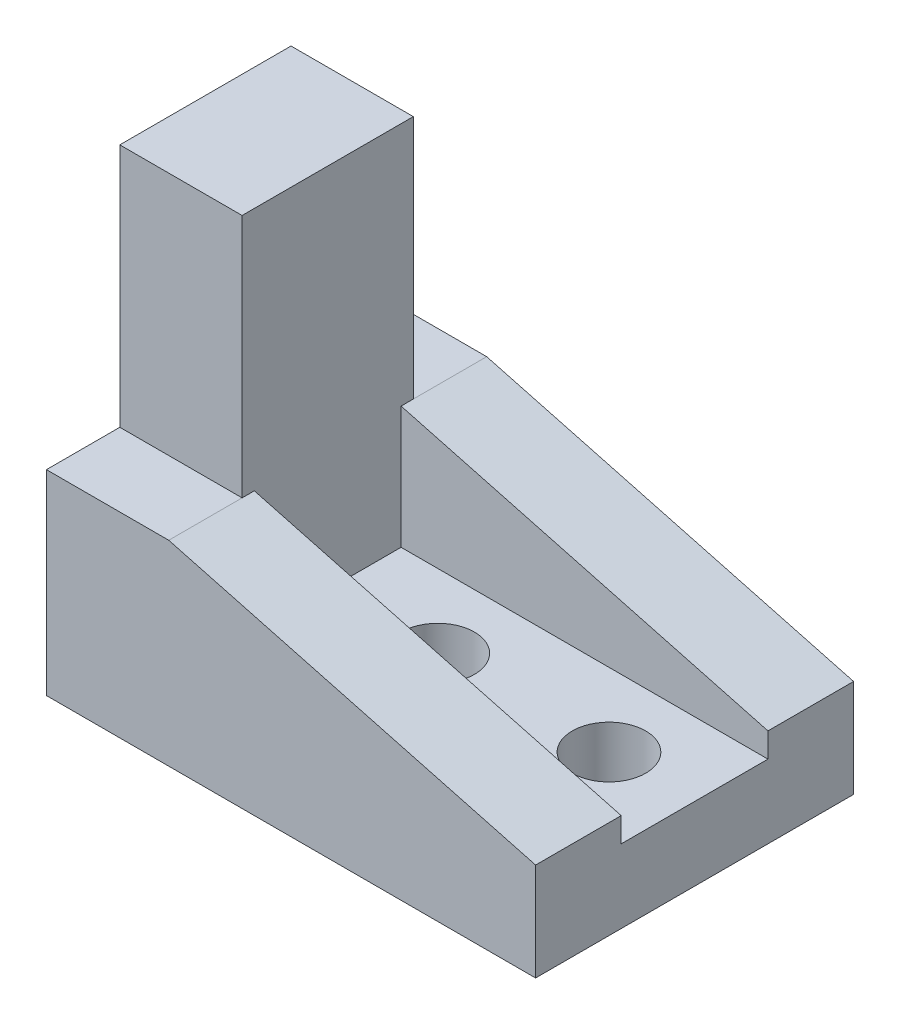
ISO-10303-21;
HEADER;
FILE_DESCRIPTION(('STEP AP214'),'2;1');
FILE_NAME('part.step','',(''),(''),'','','');
FILE_SCHEMA(('AUTOMOTIVE_DESIGN { 1 0 10303 214 1 1 1 1 }'));
ENDSEC;
DATA;
#1=APPLICATION_CONTEXT('core data for automotive mechanical design processes');
#2=APPLICATION_PROTOCOL_DEFINITION('international standard','automotive_design',2000,#1);
#3=PRODUCT_CONTEXT('',#1,'mechanical');
#4=PRODUCT('Part','Part','',(#3));
#5=PRODUCT_RELATED_PRODUCT_CATEGORY('part','',(#4));
#6=PRODUCT_DEFINITION_FORMATION('','',#4);
#7=PRODUCT_DEFINITION_CONTEXT('part definition',#1,'design');
#8=PRODUCT_DEFINITION('design','',#6,#7);
#9=PRODUCT_DEFINITION_SHAPE('','',#8);
#10=(LENGTH_UNIT() NAMED_UNIT(*) SI_UNIT(.MILLI.,.METRE.));
#11=(NAMED_UNIT(*) PLANE_ANGLE_UNIT() SI_UNIT($,.RADIAN.));
#12=(NAMED_UNIT(*) SI_UNIT($,.STERADIAN.) SOLID_ANGLE_UNIT());
#13=UNCERTAINTY_MEASURE_WITH_UNIT(LENGTH_MEASURE(1.E-05),#10,'distance_accuracy_value','');
#14=(GEOMETRIC_REPRESENTATION_CONTEXT(3) GLOBAL_UNCERTAINTY_ASSIGNED_CONTEXT((#13)) GLOBAL_UNIT_ASSIGNED_CONTEXT((#10,
#11,#12)) REPRESENTATION_CONTEXT('',''));
#15=CARTESIAN_POINT('',(0.,0.,0.));
#16=DIRECTION('',(0.,0.,1.));
#17=DIRECTION('',(1.,0.,0.));
#18=AXIS2_PLACEMENT_3D('',#15,#16,#17);
#19=CARTESIAN_POINT('',(20.,0.,13.));
#20=DIRECTION('',(-1.,0.,0.));
#21=DIRECTION('',(0.,0.,1.));
#22=AXIS2_PLACEMENT_3D('',#19,#20,#21);
#23=PLANE('',#22);
#24=DIRECTION('',(0.,1.,0.));
#25=VECTOR('',#24,1.);
#26=CARTESIAN_POINT('',(20.,3.,3.5));
#27=LINE('',#26,#25);
#28=CARTESIAN_POINT('',(20.,3.,3.5));
#29=VERTEX_POINT('',#28);
#30=CARTESIAN_POINT('',(20.,4.,3.5));
#31=VERTEX_POINT('',#30);
#32=EDGE_CURVE('E150',#29,#31,#27,.T.);
#33=ORIENTED_EDGE('',*,*,#32,.F.);
#34=DIRECTION('',(0.,0.,1.));
#35=VECTOR('',#34,1.);
#36=CARTESIAN_POINT('',(20.,3.,9.5));
#37=LINE('',#36,#35);
#38=CARTESIAN_POINT('',(20.,3.,9.5));
#39=VERTEX_POINT('',#38);
#40=EDGE_CURVE('E136',#29,#39,#37,.T.);
#41=ORIENTED_EDGE('',*,*,#40,.T.);
#42=DIRECTION('',(0.,1.,0.));
#43=VECTOR('',#42,1.);
#44=CARTESIAN_POINT('',(20.,3.,9.5));
#45=LINE('',#44,#43);
#46=CARTESIAN_POINT('',(20.,4.,9.5));
#47=VERTEX_POINT('',#46);
#48=EDGE_CURVE('E154',#39,#47,#45,.T.);
#49=ORIENTED_EDGE('',*,*,#48,.T.);
#50=DIRECTION('',(0.,0.,-1.));
#51=VECTOR('',#50,1.);
#52=CARTESIAN_POINT('',(20.,4.,13.));
#53=LINE('',#52,#51);
#54=CARTESIAN_POINT('',(20.,4.,13.));
#55=VERTEX_POINT('',#54);
#56=EDGE_CURVE('E212',#55,#47,#53,.T.);
#57=ORIENTED_EDGE('',*,*,#56,.F.);
#58=DIRECTION('',(0.,1.,0.));
#59=VECTOR('',#58,1.);
#60=CARTESIAN_POINT('',(20.,0.,13.));
#61=LINE('',#60,#59);
#62=CARTESIAN_POINT('',(20.,0.,13.));
#63=VERTEX_POINT('',#62);
#64=EDGE_CURVE('E188',#63,#55,#61,.T.);
#65=ORIENTED_EDGE('',*,*,#64,.F.);
#66=DIRECTION('',(0.,0.,-1.));
#67=VECTOR('',#66,1.);
#68=CARTESIAN_POINT('',(20.,0.,13.));
#69=LINE('',#68,#67);
#70=CARTESIAN_POINT('',(20.,0.,0.));
#71=VERTEX_POINT('',#70);
#72=EDGE_CURVE('E215',#63,#71,#69,.T.);
#73=ORIENTED_EDGE('',*,*,#72,.T.);
#74=DIRECTION('',(0.,1.,0.));
#75=VECTOR('',#74,1.);
#76=CARTESIAN_POINT('',(20.,0.,0.));
#77=LINE('',#76,#75);
#78=CARTESIAN_POINT('',(20.,4.,0.));
#79=VERTEX_POINT('',#78);
#80=EDGE_CURVE('E197',#71,#79,#77,.T.);
#81=ORIENTED_EDGE('',*,*,#80,.T.);
#82=EDGE_CURVE('E210',#31,#79,#53,.T.);
#83=ORIENTED_EDGE('',*,*,#82,.F.);
#84=EDGE_LOOP('',(#33,#41,#49,#57,#65,#73,#81,#83));
#85=FACE_BOUND('',#84,.T.);
#86=ADVANCED_FACE('F36',(#85),#23,.F.);
#87=CARTESIAN_POINT('',(5.,8.,13.));
#88=DIRECTION('',(-0.257662650560332,-0.966234939601246,0.));
#89=DIRECTION('',(0.966234939601246,-0.257662650560332,0.));
#90=AXIS2_PLACEMENT_3D('',#87,#88,#89);
#91=PLANE('',#90);
#92=DIRECTION('',(-0.966234939601246,0.257662650560332,0.));
#93=VECTOR('',#92,1.);
#94=CARTESIAN_POINT('',(5.,8.,3.5));
#95=LINE('',#94,#93);
#96=CARTESIAN_POINT('',(5.,8.,3.50000000000001));
#97=VERTEX_POINT('',#96);
#98=EDGE_CURVE('E11',#31,#97,#95,.T.);
#99=ORIENTED_EDGE('',*,*,#98,.F.);
#100=ORIENTED_EDGE('',*,*,#82,.T.);
#101=DIRECTION('',(-0.966234939601246,0.257662650560332,0.));
#102=VECTOR('',#101,1.);
#103=CARTESIAN_POINT('',(5.,8.,0.));
#104=LINE('',#103,#102);
#105=CARTESIAN_POINT('',(5.,8.,0.));
#106=VERTEX_POINT('',#105);
#107=EDGE_CURVE('E186',#79,#106,#104,.T.);
#108=ORIENTED_EDGE('',*,*,#107,.T.);
#109=DIRECTION('',(0.,0.,1.));
#110=VECTOR('',#109,1.);
#111=CARTESIAN_POINT('',(5.,8.,13.));
#112=LINE('',#111,#110);
#113=CARTESIAN_POINT('',(5.,8.,3.));
#114=VERTEX_POINT('',#113);
#115=EDGE_CURVE('E168',#106,#114,#112,.T.);
#116=ORIENTED_EDGE('',*,*,#115,.T.);
#117=DIRECTION('',(0.,0.,-1.));
#118=VECTOR('',#117,1.);
#119=CARTESIAN_POINT('',(5.,8.,13.));
#120=LINE('',#119,#118);
#121=EDGE_CURVE('E207',#97,#114,#120,.T.);
#122=ORIENTED_EDGE('',*,*,#121,.F.);
#123=EDGE_LOOP('',(#99,#100,#108,#116,#122));
#124=FACE_BOUND('',#123,.T.);
#125=ADVANCED_FACE('F251',(#124),#91,.F.);
#126=DIRECTION('',(0.966234939601246,-0.257662650560332,0.));
#127=VECTOR('',#126,1.);
#128=CARTESIAN_POINT('',(5.,8.,9.5));
#129=LINE('',#128,#127);
#130=CARTESIAN_POINT('',(5.,8.,9.5));
#131=VERTEX_POINT('',#130);
#132=EDGE_CURVE('E44',#131,#47,#129,.T.);
#133=ORIENTED_EDGE('',*,*,#132,.F.);
#134=CARTESIAN_POINT('',(5.,8.,10.));
#135=VERTEX_POINT('',#134);
#136=EDGE_CURVE('E211',#135,#131,#120,.T.);
#137=ORIENTED_EDGE('',*,*,#136,.F.);
#138=CARTESIAN_POINT('',(5.,8.,13.));
#139=VERTEX_POINT('',#138);
#140=EDGE_CURVE('E208',#139,#135,#120,.T.);
#141=ORIENTED_EDGE('',*,*,#140,.F.);
#142=DIRECTION('',(-0.966234939601246,0.257662650560332,0.));
#143=VECTOR('',#142,1.);
#144=CARTESIAN_POINT('',(5.,8.,13.));
#145=LINE('',#144,#143);
#146=EDGE_CURVE('E190',#55,#139,#145,.T.);
#147=ORIENTED_EDGE('',*,*,#146,.F.);
#148=ORIENTED_EDGE('',*,*,#56,.T.);
#149=EDGE_LOOP('',(#133,#137,#141,#147,#148));
#150=FACE_BOUND('',#149,.T.);
#151=ADVANCED_FACE('F234',(#150),#91,.F.);
#152=CARTESIAN_POINT('',(0.,0.,13.));
#153=DIRECTION('',(1.,0.,0.));
#154=DIRECTION('',(0.,0.,-1.));
#155=AXIS2_PLACEMENT_3D('',#152,#153,#154);
#156=PLANE('',#155);
#157=DIRECTION('',(0.,0.,-1.));
#158=VECTOR('',#157,1.);
#159=CARTESIAN_POINT('',(0.,18.,13.));
#160=LINE('',#159,#158);
#161=CARTESIAN_POINT('',(0.,18.,10.));
#162=VERTEX_POINT('',#161);
#163=CARTESIAN_POINT('',(0.,18.,3.));
#164=VERTEX_POINT('',#163);
#165=EDGE_CURVE('E193',#162,#164,#160,.T.);
#166=ORIENTED_EDGE('',*,*,#165,.T.);
#167=DIRECTION('',(0.,1.,0.));
#168=VECTOR('',#167,1.);
#169=CARTESIAN_POINT('',(0.,8.,3.));
#170=LINE('',#169,#168);
#171=CARTESIAN_POINT('',(0.,8.,3.));
#172=VERTEX_POINT('',#171);
#173=EDGE_CURVE('E161',#172,#164,#170,.T.);
#174=ORIENTED_EDGE('',*,*,#173,.F.);
#175=DIRECTION('',(0.,0.,1.));
#176=VECTOR('',#175,1.);
#177=CARTESIAN_POINT('',(0.,8.,0.));
#178=LINE('',#177,#176);
#179=CARTESIAN_POINT('',(0.,8.,0.));
#180=VERTEX_POINT('',#179);
#181=EDGE_CURVE('E158',#180,#172,#178,.T.);
#182=ORIENTED_EDGE('',*,*,#181,.F.);
#183=DIRECTION('',(0.,-1.,0.));
#184=VECTOR('',#183,1.);
#185=CARTESIAN_POINT('',(0.,0.,0.));
#186=LINE('',#185,#184);
#187=CARTESIAN_POINT('',(0.,0.,0.));
#188=VERTEX_POINT('',#187);
#189=EDGE_CURVE('E182',#180,#188,#186,.T.);
#190=ORIENTED_EDGE('',*,*,#189,.T.);
#191=DIRECTION('',(0.,0.,-1.));
#192=VECTOR('',#191,1.);
#193=CARTESIAN_POINT('',(0.,0.,13.));
#194=LINE('',#193,#192);
#195=CARTESIAN_POINT('',(0.,0.,13.));
#196=VERTEX_POINT('',#195);
#197=EDGE_CURVE('E218',#196,#188,#194,.T.);
#198=ORIENTED_EDGE('',*,*,#197,.F.);
#199=DIRECTION('',(0.,-1.,0.));
#200=VECTOR('',#199,1.);
#201=CARTESIAN_POINT('',(0.,0.,13.));
#202=LINE('',#201,#200);
#203=CARTESIAN_POINT('',(0.,8.,13.));
#204=VERTEX_POINT('',#203);
#205=EDGE_CURVE('E183',#204,#196,#202,.T.);
#206=ORIENTED_EDGE('',*,*,#205,.F.);
#207=DIRECTION('',(0.,0.,1.));
#208=VECTOR('',#207,1.);
#209=CARTESIAN_POINT('',(0.,8.,13.));
#210=LINE('',#209,#208);
#211=CARTESIAN_POINT('',(0.,8.,10.));
#212=VERTEX_POINT('',#211);
#213=EDGE_CURVE('E58',#212,#204,#210,.T.);
#214=ORIENTED_EDGE('',*,*,#213,.F.);
#215=DIRECTION('',(0.,-1.,0.));
#216=VECTOR('',#215,1.);
#217=CARTESIAN_POINT('',(0.,8.,10.));
#218=LINE('',#217,#216);
#219=EDGE_CURVE('E149',#162,#212,#218,.T.);
#220=ORIENTED_EDGE('',*,*,#219,.F.);
#221=EDGE_LOOP('',(#166,#174,#182,#190,#198,#206,#214,#220));
#222=FACE_BOUND('',#221,.T.);
#223=ADVANCED_FACE('F38',(#222),#156,.F.);
#224=CARTESIAN_POINT('',(0.,0.,13.));
#225=DIRECTION('',(0.,1.,0.));
#226=DIRECTION('',(0.,0.,1.));
#227=AXIS2_PLACEMENT_3D('',#224,#225,#226);
#228=PLANE('',#227);
#229=CARTESIAN_POINT('',(16.5,0.,6.5));
#230=DIRECTION('',(0.,1.,0.));
#231=DIRECTION('',(0.,0.,1.));
#232=AXIS2_PLACEMENT_3D('',#229,#230,#231);
#233=CIRCLE('',#232,1.5);
#234=CARTESIAN_POINT('',(16.5,0.,8.));
#235=VERTEX_POINT('',#234);
#236=EDGE_CURVE('E144',#235,#235,#233,.T.);
#237=ORIENTED_EDGE('',*,*,#236,.T.);
#238=EDGE_LOOP('',(#237));
#239=FACE_BOUND('',#238,.T.);
#240=CARTESIAN_POINT('',(9.5,0.,6.5));
#241=DIRECTION('',(0.,1.,0.));
#242=DIRECTION('',(0.,0.,1.));
#243=AXIS2_PLACEMENT_3D('',#240,#241,#242);
#244=CIRCLE('',#243,1.5);
#245=CARTESIAN_POINT('',(9.5,0.,8.));
#246=VERTEX_POINT('',#245);
#247=EDGE_CURVE('E323',#246,#246,#244,.T.);
#248=ORIENTED_EDGE('',*,*,#247,.T.);
#249=EDGE_LOOP('',(#248));
#250=FACE_BOUND('',#249,.T.);
#251=DIRECTION('',(1.,0.,0.));
#252=VECTOR('',#251,1.);
#253=CARTESIAN_POINT('',(0.,0.,0.));
#254=LINE('',#253,#252);
#255=EDGE_CURVE('E195',#188,#71,#254,.T.);
#256=ORIENTED_EDGE('',*,*,#255,.T.);
#257=ORIENTED_EDGE('',*,*,#72,.F.);
#258=DIRECTION('',(1.,0.,0.));
#259=VECTOR('',#258,1.);
#260=CARTESIAN_POINT('',(0.,0.,13.));
#261=LINE('',#260,#259);
#262=EDGE_CURVE('E185',#196,#63,#261,.T.);
#263=ORIENTED_EDGE('',*,*,#262,.F.);
#264=ORIENTED_EDGE('',*,*,#197,.T.);
#265=EDGE_LOOP('',(#256,#257,#263,#264));
#266=FACE_BOUND('',#265,.T.);
#267=ADVANCED_FACE('F266',(#239,#250,#266),#228,.F.);
#268=CARTESIAN_POINT('',(5.,18.,13.));
#269=DIRECTION('',(-1.,0.,0.));
#270=DIRECTION('',(0.,-1.,0.));
#271=AXIS2_PLACEMENT_3D('',#268,#269,#270);
#272=PLANE('',#271);
#273=ORIENTED_EDGE('',*,*,#136,.T.);
#274=DIRECTION('',(0.,1.,0.));
#275=VECTOR('',#274,1.);
#276=CARTESIAN_POINT('',(5.,3.,9.5));
#277=LINE('',#276,#275);
#278=CARTESIAN_POINT('',(5.,3.,9.5));
#279=VERTEX_POINT('',#278);
#280=EDGE_CURVE('E143',#279,#131,#277,.T.);
#281=ORIENTED_EDGE('',*,*,#280,.F.);
#282=DIRECTION('',(0.,0.,-1.));
#283=VECTOR('',#282,1.);
#284=CARTESIAN_POINT('',(5.,3.,3.5));
#285=LINE('',#284,#283);
#286=CARTESIAN_POINT('',(5.,3.,3.5));
#287=VERTEX_POINT('',#286);
#288=EDGE_CURVE('E133',#279,#287,#285,.T.);
#289=ORIENTED_EDGE('',*,*,#288,.T.);
#290=DIRECTION('',(0.,1.,0.));
#291=VECTOR('',#290,1.);
#292=CARTESIAN_POINT('',(5.,3.,3.5));
#293=LINE('',#292,#291);
#294=EDGE_CURVE('E51',#287,#97,#293,.T.);
#295=ORIENTED_EDGE('',*,*,#294,.T.);
#296=ORIENTED_EDGE('',*,*,#121,.T.);
#297=DIRECTION('',(0.,1.,0.));
#298=VECTOR('',#297,1.);
#299=CARTESIAN_POINT('',(5.,18.,3.));
#300=LINE('',#299,#298);
#301=CARTESIAN_POINT('',(5.,18.,3.));
#302=VERTEX_POINT('',#301);
#303=EDGE_CURVE('E179',#114,#302,#300,.T.);
#304=ORIENTED_EDGE('',*,*,#303,.T.);
#305=DIRECTION('',(0.,0.,-1.));
#306=VECTOR('',#305,1.);
#307=CARTESIAN_POINT('',(5.,18.,13.));
#308=LINE('',#307,#306);
#309=CARTESIAN_POINT('',(5.,18.,10.));
#310=VERTEX_POINT('',#309);
#311=EDGE_CURVE('E204',#310,#302,#308,.T.);
#312=ORIENTED_EDGE('',*,*,#311,.F.);
#313=DIRECTION('',(0.,-1.,0.));
#314=VECTOR('',#313,1.);
#315=CARTESIAN_POINT('',(5.,18.,10.));
#316=LINE('',#315,#314);
#317=EDGE_CURVE('E176',#310,#135,#316,.T.);
#318=ORIENTED_EDGE('',*,*,#317,.T.);
#319=EDGE_LOOP('',(#273,#281,#289,#295,#296,#304,#312,#318));
#320=FACE_BOUND('',#319,.T.);
#321=ADVANCED_FACE('F142',(#320),#272,.F.);
#322=CARTESIAN_POINT('',(0.,18.,13.));
#323=DIRECTION('',(0.,-1.,0.));
#324=DIRECTION('',(0.,0.,-1.));
#325=AXIS2_PLACEMENT_3D('',#322,#323,#324);
#326=PLANE('',#325);
#327=ORIENTED_EDGE('',*,*,#311,.T.);
#328=DIRECTION('',(-1.,0.,0.));
#329=VECTOR('',#328,1.);
#330=CARTESIAN_POINT('',(20.,18.,3.));
#331=LINE('',#330,#329);
#332=EDGE_CURVE('E165',#302,#164,#331,.T.);
#333=ORIENTED_EDGE('',*,*,#332,.T.);
#334=ORIENTED_EDGE('',*,*,#165,.F.);
#335=DIRECTION('',(-1.,0.,0.));
#336=VECTOR('',#335,1.);
#337=CARTESIAN_POINT('',(20.,18.,10.));
#338=LINE('',#337,#336);
#339=EDGE_CURVE('E171',#310,#162,#338,.T.);
#340=ORIENTED_EDGE('',*,*,#339,.F.);
#341=EDGE_LOOP('',(#327,#333,#334,#340));
#342=FACE_BOUND('',#341,.T.);
#343=ADVANCED_FACE('F261',(#342),#326,.F.);
#344=CARTESIAN_POINT('',(0.,0.,13.));
#345=DIRECTION('',(0.,0.,-1.));
#346=DIRECTION('',(-1.,0.,0.));
#347=AXIS2_PLACEMENT_3D('',#344,#345,#346);
#348=PLANE('',#347);
#349=ORIENTED_EDGE('',*,*,#146,.T.);
#350=DIRECTION('',(-1.,0.,0.));
#351=VECTOR('',#350,1.);
#352=CARTESIAN_POINT('',(0.,8.,13.));
#353=LINE('',#352,#351);
#354=EDGE_CURVE('E223',#139,#204,#353,.T.);
#355=ORIENTED_EDGE('',*,*,#354,.T.);
#356=ORIENTED_EDGE('',*,*,#205,.T.);
#357=ORIENTED_EDGE('',*,*,#262,.T.);
#358=ORIENTED_EDGE('',*,*,#64,.T.);
#359=EDGE_LOOP('',(#349,#355,#356,#357,#358));
#360=FACE_BOUND('',#359,.T.);
#361=ADVANCED_FACE('F237',(#360),#348,.F.);
#362=CARTESIAN_POINT('',(0.,0.,0.));
#363=DIRECTION('',(0.,0.,-1.));
#364=DIRECTION('',(-1.,0.,0.));
#365=AXIS2_PLACEMENT_3D('',#362,#363,#364);
#366=PLANE('',#365);
#367=DIRECTION('',(-1.,0.,0.));
#368=VECTOR('',#367,1.);
#369=CARTESIAN_POINT('',(0.,8.,0.));
#370=LINE('',#369,#368);
#371=EDGE_CURVE('E221',#106,#180,#370,.T.);
#372=ORIENTED_EDGE('',*,*,#371,.F.);
#373=ORIENTED_EDGE('',*,*,#107,.F.);
#374=ORIENTED_EDGE('',*,*,#80,.F.);
#375=ORIENTED_EDGE('',*,*,#255,.F.);
#376=ORIENTED_EDGE('',*,*,#189,.F.);
#377=EDGE_LOOP('',(#372,#373,#374,#375,#376));
#378=FACE_BOUND('',#377,.T.);
#379=ADVANCED_FACE('F248',(#378),#366,.T.);
#380=CARTESIAN_POINT('',(20.,8.,3.));
#381=DIRECTION('',(0.,0.,1.));
#382=DIRECTION('',(0.,-1.,0.));
#383=AXIS2_PLACEMENT_3D('',#380,#381,#382);
#384=PLANE('',#383);
#385=DIRECTION('',(-1.,0.,0.));
#386=VECTOR('',#385,1.);
#387=CARTESIAN_POINT('',(20.,8.,3.));
#388=LINE('',#387,#386);
#389=EDGE_CURVE('E164',#114,#172,#388,.T.);
#390=ORIENTED_EDGE('',*,*,#389,.T.);
#391=ORIENTED_EDGE('',*,*,#173,.T.);
#392=ORIENTED_EDGE('',*,*,#332,.F.);
#393=ORIENTED_EDGE('',*,*,#303,.F.);
#394=EDGE_LOOP('',(#390,#391,#392,#393));
#395=FACE_BOUND('',#394,.T.);
#396=ADVANCED_FACE('F287',(#395),#384,.F.);
#397=CARTESIAN_POINT('',(20.,8.,0.));
#398=DIRECTION('',(0.,-1.,0.));
#399=DIRECTION('',(0.,0.,-1.));
#400=AXIS2_PLACEMENT_3D('',#397,#398,#399);
#401=PLANE('',#400);
#402=ORIENTED_EDGE('',*,*,#371,.T.);
#403=ORIENTED_EDGE('',*,*,#181,.T.);
#404=ORIENTED_EDGE('',*,*,#389,.F.);
#405=ORIENTED_EDGE('',*,*,#115,.F.);
#406=EDGE_LOOP('',(#402,#403,#404,#405));
#407=FACE_BOUND('',#406,.T.);
#408=ADVANCED_FACE('F293',(#407),#401,.F.);
#409=CARTESIAN_POINT('',(20.,8.,10.));
#410=DIRECTION('',(0.,0.,-1.));
#411=DIRECTION('',(0.,1.,0.));
#412=AXIS2_PLACEMENT_3D('',#409,#410,#411);
#413=PLANE('',#412);
#414=ORIENTED_EDGE('',*,*,#339,.T.);
#415=ORIENTED_EDGE('',*,*,#219,.T.);
#416=DIRECTION('',(-1.,0.,0.));
#417=VECTOR('',#416,1.);
#418=CARTESIAN_POINT('',(20.,8.,10.));
#419=LINE('',#418,#417);
#420=EDGE_CURVE('E162',#135,#212,#419,.T.);
#421=ORIENTED_EDGE('',*,*,#420,.F.);
#422=ORIENTED_EDGE('',*,*,#317,.F.);
#423=EDGE_LOOP('',(#414,#415,#421,#422));
#424=FACE_BOUND('',#423,.T.);
#425=ADVANCED_FACE('F257',(#424),#413,.F.);
#426=CARTESIAN_POINT('',(20.,8.,13.));
#427=DIRECTION('',(0.,-1.,0.));
#428=DIRECTION('',(0.,0.,-1.));
#429=AXIS2_PLACEMENT_3D('',#426,#427,#428);
#430=PLANE('',#429);
#431=ORIENTED_EDGE('',*,*,#420,.T.);
#432=ORIENTED_EDGE('',*,*,#213,.T.);
#433=ORIENTED_EDGE('',*,*,#354,.F.);
#434=ORIENTED_EDGE('',*,*,#140,.T.);
#435=EDGE_LOOP('',(#431,#432,#433,#434));
#436=FACE_BOUND('',#435,.T.);
#437=ADVANCED_FACE('F292',(#436),#430,.F.);
#438=CARTESIAN_POINT('',(20.,3.,3.5));
#439=DIRECTION('',(0.,0.,1.));
#440=DIRECTION('',(1.,0.,0.));
#441=AXIS2_PLACEMENT_3D('',#438,#439,#440);
#442=PLANE('',#441);
#443=ORIENTED_EDGE('',*,*,#98,.T.);
#444=ORIENTED_EDGE('',*,*,#294,.F.);
#445=DIRECTION('',(1.,0.,0.));
#446=VECTOR('',#445,1.);
#447=CARTESIAN_POINT('',(20.,3.,3.5));
#448=LINE('',#447,#446);
#449=EDGE_CURVE('E130',#287,#29,#448,.T.);
#450=ORIENTED_EDGE('',*,*,#449,.T.);
#451=ORIENTED_EDGE('',*,*,#32,.T.);
#452=EDGE_LOOP('',(#443,#444,#450,#451));
#453=FACE_BOUND('',#452,.T.);
#454=ADVANCED_FACE('F146',(#453),#442,.T.);
#455=CARTESIAN_POINT('',(5.,3.,9.5));
#456=DIRECTION('',(0.,0.,-1.));
#457=DIRECTION('',(-1.,0.,0.));
#458=AXIS2_PLACEMENT_3D('',#455,#456,#457);
#459=PLANE('',#458);
#460=ORIENTED_EDGE('',*,*,#132,.T.);
#461=ORIENTED_EDGE('',*,*,#48,.F.);
#462=DIRECTION('',(-1.,0.,0.));
#463=VECTOR('',#462,1.);
#464=CARTESIAN_POINT('',(5.,3.,9.5));
#465=LINE('',#464,#463);
#466=EDGE_CURVE('E333',#39,#279,#465,.T.);
#467=ORIENTED_EDGE('',*,*,#466,.T.);
#468=ORIENTED_EDGE('',*,*,#280,.T.);
#469=EDGE_LOOP('',(#460,#461,#467,#468));
#470=FACE_BOUND('',#469,.T.);
#471=ADVANCED_FACE('F227',(#470),#459,.T.);
#472=CARTESIAN_POINT('',(0.,3.,0.));
#473=DIRECTION('',(0.,1.,0.));
#474=DIRECTION('',(0.,0.,1.));
#475=AXIS2_PLACEMENT_3D('',#472,#473,#474);
#476=PLANE('',#475);
#477=CARTESIAN_POINT('',(16.5,3.,6.5));
#478=DIRECTION('',(0.,1.,0.));
#479=DIRECTION('',(0.,0.,1.));
#480=AXIS2_PLACEMENT_3D('',#477,#478,#479);
#481=CIRCLE('',#480,1.5);
#482=CARTESIAN_POINT('',(16.5,3.,8.));
#483=VERTEX_POINT('',#482);
#484=EDGE_CURVE('E322',#483,#483,#481,.T.);
#485=ORIENTED_EDGE('',*,*,#484,.F.);
#486=EDGE_LOOP('',(#485));
#487=FACE_BOUND('',#486,.T.);
#488=CARTESIAN_POINT('',(9.5,3.,6.5));
#489=DIRECTION('',(0.,1.,0.));
#490=DIRECTION('',(0.,0.,1.));
#491=AXIS2_PLACEMENT_3D('',#488,#489,#490);
#492=CIRCLE('',#491,1.5);
#493=CARTESIAN_POINT('',(9.5,3.,8.));
#494=VERTEX_POINT('',#493);
#495=EDGE_CURVE('E327',#494,#494,#492,.T.);
#496=ORIENTED_EDGE('',*,*,#495,.F.);
#497=EDGE_LOOP('',(#496));
#498=FACE_BOUND('',#497,.T.);
#499=ORIENTED_EDGE('',*,*,#288,.F.);
#500=ORIENTED_EDGE('',*,*,#466,.F.);
#501=ORIENTED_EDGE('',*,*,#40,.F.);
#502=ORIENTED_EDGE('',*,*,#449,.F.);
#503=EDGE_LOOP('',(#499,#500,#501,#502));
#504=FACE_BOUND('',#503,.T.);
#505=ADVANCED_FACE('F131',(#487,#498,#504),#476,.T.);
#506=CARTESIAN_POINT('',(9.5,0.,6.5));
#507=DIRECTION('',(0.,1.,0.));
#508=DIRECTION('',(0.,0.,1.));
#509=AXIS2_PLACEMENT_3D('',#506,#507,#508);
#510=CYLINDRICAL_SURFACE('',#509,1.5);
#511=ORIENTED_EDGE('',*,*,#247,.F.);
#512=EDGE_LOOP('',(#511));
#513=FACE_BOUND('',#512,.T.);
#514=ORIENTED_EDGE('',*,*,#495,.T.);
#515=EDGE_LOOP('',(#514));
#516=FACE_BOUND('',#515,.T.);
#517=ADVANCED_FACE('F308',(#513,#516),#510,.F.);
#518=CARTESIAN_POINT('',(16.5,0.,6.5));
#519=DIRECTION('',(0.,1.,0.));
#520=DIRECTION('',(0.,0.,1.));
#521=AXIS2_PLACEMENT_3D('',#518,#519,#520);
#522=CYLINDRICAL_SURFACE('',#521,1.5);
#523=ORIENTED_EDGE('',*,*,#236,.F.);
#524=EDGE_LOOP('',(#523));
#525=FACE_BOUND('',#524,.T.);
#526=ORIENTED_EDGE('',*,*,#484,.T.);
#527=EDGE_LOOP('',(#526));
#528=FACE_BOUND('',#527,.T.);
#529=ADVANCED_FACE('F312',(#525,#528),#522,.F.);
#530=CLOSED_SHELL('',(#86,#125,#151,#223,#267,#321,#343,#361,#379,#396,#408,#425,#437,#454,#471,
#505,#517,#529));
#531=MANIFOLD_SOLID_BREP('B2',#530);
#532=ADVANCED_BREP_SHAPE_REPRESENTATION('',(#18,#531),#14);
#533=SHAPE_DEFINITION_REPRESENTATION(#9,#532);
ENDSEC;
END-ISO-10303-21;
